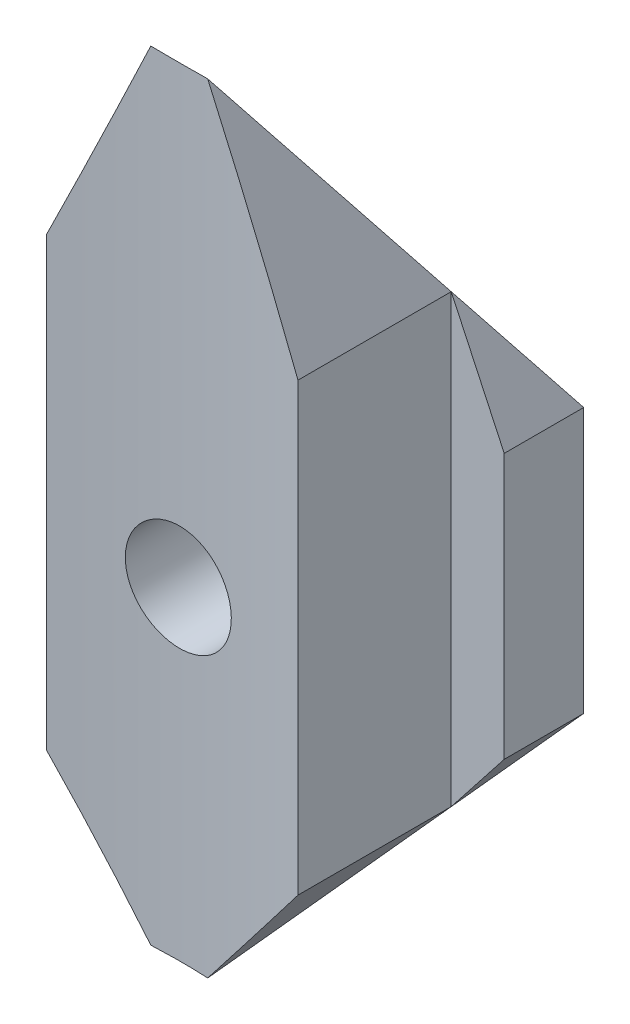
ISO-10303-21;
HEADER;
FILE_DESCRIPTION(('STEP AP214'),'2;1');
FILE_NAME('part.step','',(''),(''),'','','');
FILE_SCHEMA(('AUTOMOTIVE_DESIGN { 1 0 10303 214 1 1 1 1 }'));
ENDSEC;
DATA;
#1=APPLICATION_CONTEXT('core data for automotive mechanical design processes');
#2=APPLICATION_PROTOCOL_DEFINITION('international standard','automotive_design',2000,#1);
#3=PRODUCT_CONTEXT('',#1,'mechanical');
#4=PRODUCT('Part','Part','',(#3));
#5=PRODUCT_RELATED_PRODUCT_CATEGORY('part','',(#4));
#6=PRODUCT_DEFINITION_FORMATION('','',#4);
#7=PRODUCT_DEFINITION_CONTEXT('part definition',#1,'design');
#8=PRODUCT_DEFINITION('design','',#6,#7);
#9=PRODUCT_DEFINITION_SHAPE('','',#8);
#10=(LENGTH_UNIT() NAMED_UNIT(*) SI_UNIT(.MILLI.,.METRE.));
#11=(NAMED_UNIT(*) PLANE_ANGLE_UNIT() SI_UNIT($,.RADIAN.));
#12=(NAMED_UNIT(*) SI_UNIT($,.STERADIAN.) SOLID_ANGLE_UNIT());
#13=UNCERTAINTY_MEASURE_WITH_UNIT(LENGTH_MEASURE(1.E-05),#10,'distance_accuracy_value','');
#14=(GEOMETRIC_REPRESENTATION_CONTEXT(3) GLOBAL_UNCERTAINTY_ASSIGNED_CONTEXT((#13)) GLOBAL_UNIT_ASSIGNED_CONTEXT((#10,
#11,#12)) REPRESENTATION_CONTEXT('',''));
#15=CARTESIAN_POINT('',(0.,0.,0.));
#16=DIRECTION('',(0.,0.,1.));
#17=DIRECTION('',(1.,0.,0.));
#18=AXIS2_PLACEMENT_3D('',#15,#16,#17);
#19=CARTESIAN_POINT('',(6.75,30.,-8.5));
#20=DIRECTION('',(-1.,0.,0.));
#21=DIRECTION('',(0.,0.,1.));
#22=AXIS2_PLACEMENT_3D('',#19,#20,#21);
#23=PLANE('',#22);
#24=DIRECTION('',(0.,0.,-1.));
#25=VECTOR('',#24,1.);
#26=CARTESIAN_POINT('',(6.75000000000001,17.4565295089996,6.5));
#27=LINE('',#26,#25);
#28=CARTESIAN_POINT('',(6.75000000000001,17.4565295089996,-5.5));
#29=VERTEX_POINT('',#28);
#30=CARTESIAN_POINT('',(6.75000000000001,17.4565295089996,-8.5));
#31=VERTEX_POINT('',#30);
#32=EDGE_CURVE('E239',#29,#31,#27,.T.);
#33=ORIENTED_EDGE('',*,*,#32,.F.);
#34=DIRECTION('',(0.,-1.,0.));
#35=VECTOR('',#34,1.);
#36=CARTESIAN_POINT('',(6.75000000000001,30.,-5.5));
#37=LINE('',#36,#35);
#38=CARTESIAN_POINT('',(6.75000000000001,7.45652950899955,-5.5));
#39=VERTEX_POINT('',#38);
#40=EDGE_CURVE('E142',#29,#39,#37,.T.);
#41=ORIENTED_EDGE('',*,*,#40,.T.);
#42=DIRECTION('',(0.,0.,-1.));
#43=VECTOR('',#42,1.);
#44=CARTESIAN_POINT('',(6.75000000000001,7.45652950899955,6.5));
#45=LINE('',#44,#43);
#46=CARTESIAN_POINT('',(6.75000000000001,7.45652950899955,-8.5));
#47=VERTEX_POINT('',#46);
#48=EDGE_CURVE('E127',#39,#47,#45,.T.);
#49=ORIENTED_EDGE('',*,*,#48,.T.);
#50=DIRECTION('',(0.,-1.,0.));
#51=VECTOR('',#50,1.);
#52=CARTESIAN_POINT('',(6.75,30.,-8.5));
#53=LINE('',#52,#51);
#54=EDGE_CURVE('E140',#31,#47,#53,.T.);
#55=ORIENTED_EDGE('',*,*,#54,.F.);
#56=EDGE_LOOP('',(#33,#41,#49,#55));
#57=FACE_BOUND('',#56,.T.);
#58=ADVANCED_FACE('F41',(#57),#23,.F.);
#59=CARTESIAN_POINT('',(-6.74999999999999,30.,-5.5));
#60=DIRECTION('',(1.,0.,0.));
#61=DIRECTION('',(0.,0.,-1.));
#62=AXIS2_PLACEMENT_3D('',#59,#60,#61);
#63=PLANE('',#62);
#64=DIRECTION('',(0.,0.,-1.));
#65=VECTOR('',#64,1.);
#66=CARTESIAN_POINT('',(-6.75,17.4565295089996,6.5));
#67=LINE('',#66,#65);
#68=CARTESIAN_POINT('',(-6.75,17.4565295089996,-5.5));
#69=VERTEX_POINT('',#68);
#70=CARTESIAN_POINT('',(-6.75,17.4565295089996,-8.5));
#71=VERTEX_POINT('',#70);
#72=EDGE_CURVE('E236',#69,#71,#67,.T.);
#73=ORIENTED_EDGE('',*,*,#72,.T.);
#74=DIRECTION('',(0.,-1.,0.));
#75=VECTOR('',#74,1.);
#76=CARTESIAN_POINT('',(-6.75,30.,-8.5));
#77=LINE('',#76,#75);
#78=CARTESIAN_POINT('',(-6.75,7.45652950899955,-8.5));
#79=VERTEX_POINT('',#78);
#80=EDGE_CURVE('E161',#71,#79,#77,.T.);
#81=ORIENTED_EDGE('',*,*,#80,.T.);
#82=DIRECTION('',(0.,0.,-1.));
#83=VECTOR('',#82,1.);
#84=CARTESIAN_POINT('',(-6.75,7.45652950899955,6.5));
#85=LINE('',#84,#83);
#86=CARTESIAN_POINT('',(-6.75,7.45652950899955,-5.5));
#87=VERTEX_POINT('',#86);
#88=EDGE_CURVE('E144',#87,#79,#85,.T.);
#89=ORIENTED_EDGE('',*,*,#88,.F.);
#90=DIRECTION('',(0.,-1.,0.));
#91=VECTOR('',#90,1.);
#92=CARTESIAN_POINT('',(-6.74999999999999,30.,-5.5));
#93=LINE('',#92,#91);
#94=EDGE_CURVE('E165',#69,#87,#93,.T.);
#95=ORIENTED_EDGE('',*,*,#94,.F.);
#96=EDGE_LOOP('',(#73,#81,#89,#95));
#97=FACE_BOUND('',#96,.T.);
#98=ADVANCED_FACE('F235',(#97),#63,.F.);
#99=CARTESIAN_POINT('',(-4.74999999999999,30.,-5.5));
#100=DIRECTION('',(0.,0.,-1.));
#101=DIRECTION('',(-1.,0.,0.));
#102=AXIS2_PLACEMENT_3D('',#99,#100,#101);
#103=PLANE('',#102);
#104=DIRECTION('',(0.422988413872639,0.906135090220828,0.));
#105=VECTOR('',#104,1.);
#106=CARTESIAN_POINT('',(-1.58444197468115,28.5223016053543,-5.5));
#107=LINE('',#106,#105);
#108=CARTESIAN_POINT('',(-4.74999999999999,21.7409735292259,-5.5));
#109=VERTEX_POINT('',#108);
#110=EDGE_CURVE('E231',#69,#109,#107,.T.);
#111=ORIENTED_EDGE('',*,*,#110,.F.);
#112=ORIENTED_EDGE('',*,*,#94,.T.);
#113=DIRECTION('',(-0.617603270572078,0.786489796614471,0.));
#114=VECTOR('',#113,1.);
#115=CARTESIAN_POINT('',(-16.9373677887338,20.4296810481364,-5.49999999999999));
#116=LINE('',#115,#114);
#117=CARTESIAN_POINT('',(-4.75,4.90962007995474,-5.50000000000001));
#118=VERTEX_POINT('',#117);
#119=EDGE_CURVE('E211',#118,#87,#116,.T.);
#120=ORIENTED_EDGE('',*,*,#119,.F.);
#121=DIRECTION('',(0.,-1.,0.));
#122=VECTOR('',#121,1.);
#123=CARTESIAN_POINT('',(-4.74999999999999,30.,-5.5));
#124=LINE('',#123,#122);
#125=EDGE_CURVE('E222',#109,#118,#124,.T.);
#126=ORIENTED_EDGE('',*,*,#125,.F.);
#127=EDGE_LOOP('',(#111,#112,#120,#126));
#128=FACE_BOUND('',#127,.T.);
#129=ADVANCED_FACE('F229',(#128),#103,.F.);
#130=CARTESIAN_POINT('',(-4.74999999999999,30.,0.283032593109529));
#131=DIRECTION('',(1.,0.,0.));
#132=DIRECTION('',(0.,0.,-1.));
#133=AXIS2_PLACEMENT_3D('',#130,#131,#132);
#134=PLANE('',#133);
#135=DIRECTION('',(0.,0.,1.));
#136=VECTOR('',#135,1.);
#137=CARTESIAN_POINT('',(-4.74999999999999,21.7409735292259,0.283032593109529));
#138=LINE('',#137,#136);
#139=CARTESIAN_POINT('',(-4.74999999999999,21.7409735292259,0.283032593109529));
#140=VERTEX_POINT('',#139);
#141=EDGE_CURVE('E246',#109,#140,#138,.T.);
#142=ORIENTED_EDGE('',*,*,#141,.F.);
#143=ORIENTED_EDGE('',*,*,#125,.T.);
#144=DIRECTION('',(0.,0.,-1.));
#145=VECTOR('',#144,1.);
#146=CARTESIAN_POINT('',(-4.74999999999999,4.90962007995473,0.283032593109529));
#147=LINE('',#146,#145);
#148=CARTESIAN_POINT('',(-4.74999999999999,4.90962007995473,0.283032593109529));
#149=VERTEX_POINT('',#148);
#150=EDGE_CURVE('E209',#149,#118,#147,.T.);
#151=ORIENTED_EDGE('',*,*,#150,.F.);
#152=DIRECTION('',(0.,-1.,0.));
#153=VECTOR('',#152,1.);
#154=CARTESIAN_POINT('',(-4.74999999999999,30.,0.283032593109529));
#155=LINE('',#154,#153);
#156=EDGE_CURVE('E219',#140,#149,#155,.T.);
#157=ORIENTED_EDGE('',*,*,#156,.F.);
#158=EDGE_LOOP('',(#142,#143,#151,#157));
#159=FACE_BOUND('',#158,.T.);
#160=ADVANCED_FACE('F256',(#159),#134,.F.);
#161=CARTESIAN_POINT('',(0.,30.,40.));
#162=DIRECTION('',(0.,-1.,0.));
#163=DIRECTION('',(0.,0.,-1.));
#164=AXIS2_PLACEMENT_3D('',#161,#162,#163);
#165=CYLINDRICAL_SURFACE('',#164,40.);
#166=CARTESIAN_POINT('',(0.,14.4565295089996,0.));
#167=CARTESIAN_POINT('',(0.11226561691105,14.4565245543857,6.68941218069056E-07));
#168=CARTESIAN_POINT('',(0.224610849133381,14.4470450846484,0.000477695743243791));
#169=CARTESIAN_POINT('',(0.446202106970099,14.4093640353853,0.00233479079973984));
#170=CARTESIAN_POINT('',(0.555444322678374,14.3811403969083,0.00371592301722058));
#171=CARTESIAN_POINT('',(0.767587516754001,14.3067811034533,0.00722490791200662));
#172=CARTESIAN_POINT('',(0.870491695889499,14.2606545769807,0.00935237998494546));
#173=CARTESIAN_POINT('',(1.0670687455838,14.1518128960732,0.0141144397795993));
#174=CARTESIAN_POINT('',(1.16074378814924,14.0891016575846,0.0167489077506099));
#175=CARTESIAN_POINT('',(1.33632598574583,13.9488001649245,0.0222315728926882));
#176=CARTESIAN_POINT('',(1.41822266811324,13.8711968108571,0.0250799568829259));
#177=CARTESIAN_POINT('',(1.5678341577616,13.703340110993,0.0306678128961989));
#178=CARTESIAN_POINT('',(1.63554838571451,13.6130862486966,0.0334072804664903));
#179=CARTESIAN_POINT('',(1.7549016777892,13.42243557697,0.0384697065302309));
#180=CARTESIAN_POINT('',(1.80653256433003,13.3220336419973,0.0407924528879401));
#181=CARTESIAN_POINT('',(1.89220109729626,13.1139729458004,0.0447572310710058));
#182=CARTESIAN_POINT('',(1.92623887723076,13.0063142396527,0.0463992680620541));
#183=CARTESIAN_POINT('',(1.97572732304414,12.7868923687844,0.0488157703274723));
#184=CARTESIAN_POINT('',(1.99119365716441,12.6751327460641,0.0495909668943398));
#185=CARTESIAN_POINT('',(2.00314852073654,12.4506010608594,0.0501885666588715));
#186=CARTESIAN_POINT('',(1.99963719995225,12.3378290063718,0.0500109773755301));
#187=CARTESIAN_POINT('',(1.97374948002459,12.1145801432011,0.0487237116282245));
#188=CARTESIAN_POINT('',(1.95139001033192,12.0041013659042,0.0476148716191089));
#189=CARTESIAN_POINT('',(1.88846693076794,11.7884672809232,0.0445913990471616));
#190=CARTESIAN_POINT('',(1.84790324397277,11.6833119957361,0.0426767630793551));
#191=CARTESIAN_POINT('',(1.7497038510457,11.4812553315413,0.0382565307870804));
#192=CARTESIAN_POINT('',(1.69206042665315,11.3843577096815,0.035750667393977));
#193=CARTESIAN_POINT('',(1.56134346775138,11.201608035611,0.030430687980218));
#194=CARTESIAN_POINT('',(1.48826982434796,11.1157560613586,0.0276165697842128));
#195=CARTESIAN_POINT('',(1.32867118390876,10.9574361691118,0.0219935416725127));
#196=CARTESIAN_POINT('',(1.24213152637151,10.8849830288833,0.0191846408502466));
#197=CARTESIAN_POINT('',(1.05810892523512,10.7556313578359,0.013891610196134));
#198=CARTESIAN_POINT('',(0.960625978944205,10.698732830843,0.0114074804441733));
#199=CARTESIAN_POINT('',(0.757475340353888,10.6021069445533,0.00704384827841216));
#200=CARTESIAN_POINT('',(0.651807402377395,10.5623801009098,0.00516436402211598));
#201=CARTESIAN_POINT('',(0.43529014169846,10.5012349404002,0.00222210865747381));
#202=CARTESIAN_POINT('',(0.324440857791489,10.4798164864727,0.00115933143505013));
#203=CARTESIAN_POINT('',(0.100835801441982,10.4559143105024,-2.89471006151777E-05));
#204=CARTESIAN_POINT('',(-0.0119177809093448,10.4534101481857,-0.000155460211643967));
#205=CARTESIAN_POINT('',(-0.23624354753432,10.4673542971315,0.000540361418012085));
#206=CARTESIAN_POINT('',(-0.347815735713978,10.4838025457125,0.00136269302057018));
#207=CARTESIAN_POINT('',(-0.566554310425205,10.5351676928944,0.00386293130750737));
#208=CARTESIAN_POINT('',(-0.673722893926892,10.5700752585053,0.00554040561821324));
#209=CARTESIAN_POINT('',(-0.880679810996343,10.6573586794118,0.00956206844937632));
#210=CARTESIAN_POINT('',(-0.980468102077093,10.7097346352601,0.0119062608076329));
#211=CARTESIAN_POINT('',(-1.1699256637931,10.8305204066719,0.0170001698165979));
#212=CARTESIAN_POINT('',(-1.2595861896216,10.8989439240369,0.019750232261082));
#213=CARTESIAN_POINT('',(-1.42615516033645,11.0498625066938,0.0253450188142986));
#214=CARTESIAN_POINT('',(-1.50306352340609,11.132357662261,0.0281897435302349));
#215=CARTESIAN_POINT('',(-1.6420138362136,11.3091657173867,0.0336561094536801));
#216=CARTESIAN_POINT('',(-1.70404256088329,11.4034890173034,0.0362775508817325));
#217=CARTESIAN_POINT('',(-1.81138243847187,11.6012233147107,0.0409986023390366));
#218=CARTESIAN_POINT('',(-1.85669366414682,11.7046342726485,0.0430982146393224));
#219=CARTESIAN_POINT('',(-1.92928926590116,11.9175594323813,0.046537418497613));
#220=CARTESIAN_POINT('',(-1.95658207301353,12.0270707536947,0.0478773654705686));
#221=CARTESIAN_POINT('',(-1.9923936702811,12.2491283276836,0.0496471372129617));
#222=CARTESIAN_POINT('',(-2.00091256702396,12.3616745631248,0.0500769671495297));
#223=CARTESIAN_POINT('',(-1.99893350883703,12.5864755405263,0.0499779053949473));
#224=CARTESIAN_POINT('',(-1.98845635938041,12.6987304667078,0.0494500625971334));
#225=CARTESIAN_POINT('',(-1.94882562334041,12.9198854863023,0.0474973636395017));
#226=CARTESIAN_POINT('',(-1.91967200116262,13.028785573321,0.0460725057701147));
#227=CARTESIAN_POINT('',(-1.84352013202289,13.2401440021923,0.0424866051520056));
#228=CARTESIAN_POINT('',(-1.79652175410202,13.3426022967634,0.0403255570005496));
#229=CARTESIAN_POINT('',(-1.68601807913172,13.5381752757945,0.0355109107372312));
#230=CARTESIAN_POINT('',(-1.62251328855578,13.6312902468183,0.0328573277387455));
#231=CARTESIAN_POINT('',(-1.48072496730499,13.8056372980288,0.0273533786663928));
#232=CARTESIAN_POINT('',(-1.40242693454728,13.8868575777597,0.0245028212489989));
#233=CARTESIAN_POINT('',(-1.2332842397964,14.0350262282954,0.0189275512454243));
#234=CARTESIAN_POINT('',(-1.14243649593039,14.101971083135,0.0162028697910041));
#235=CARTESIAN_POINT('',(-0.950701902619181,14.2197198696222,0.0111844953742809));
#236=CARTESIAN_POINT('',(-0.849805517457556,14.2705082741377,0.00889121787164615));
#237=CARTESIAN_POINT('',(-0.640981745076911,14.3543634260826,0.00500027916869611));
#238=CARTESIAN_POINT('',(-0.533062832578584,14.3874511055095,0.00340179675973397));
#239=CARTESIAN_POINT('',(-0.353727852036426,14.4262866059985,0.00150335958820526));
#240=CARTESIAN_POINT('',(-0.283473365616929,14.4376132154822,0.000942077337848451));
#241=CARTESIAN_POINT('',(-0.142156561677924,14.4527362325698,0.000190185892287796));
#242=CARTESIAN_POINT('',(-0.0710942448477627,14.4565326465989,-4.23619199312314E-07));
#243=CARTESIAN_POINT('',(0.,14.4565295089996,0.));
#244=B_SPLINE_CURVE_WITH_KNOTS('',3,(#166,#167,#168,#169,#170,#171,#172,#173,#174,#175,#176,
#177,#178,#179,#180,#181,#182,#183,#184,#185,#186,#187,#188,#189,#190,#191,#192,#193,#194,#195,
#196,#197,#198,#199,#200,#201,#202,#203,#204,#205,#206,#207,#208,#209,#210,#211,#212,#213,#214,
#215,#216,#217,#218,#219,#220,#221,#222,#223,#224,#225,#226,#227,#228,#229,#230,#231,#232,#233,
#234,#235,#236,#237,#238,#239,#240,#241,#242,#243),.UNSPECIFIED.,.T.,.F.,(4,2,2,2,2,2,2,2,2,2,2,
2,2,2,2,2,2,2,2,2,2,2,2,2,2,2,2,2,2,2,2,2,2,2,2,2,2,2,4),(0.,0.336537330208493,
0.673471415625032,1.0102339269084,1.34691699344225,1.68389759324273,2.02089195541841,
2.35805738387917,2.69522025364953,3.03209846764322,3.36897402313642,3.70554731824559,
4.04212203559462,4.37884908219658,4.71557850522954,5.05267712546198,5.38977582861241,
5.7268846538922,6.06399095546453,6.40073290120862,6.73747373324478,7.07404447241389,
7.41061714900934,7.74747825258439,8.08434151734546,8.42150308697864,8.75866318923709,
9.09566541823679,9.43266573392305,9.76929717200414,10.1059292516535,10.4425638018228,
10.7791880241058,11.1161439737318,11.4531828183021,11.790544601777,12.1275065511194,
12.3406251214153,12.5537435098637),.UNSPECIFIED.);
#245=CARTESIAN_POINT('',(0.,14.4565295089996,0.));
#246=VERTEX_POINT('',#245);
#247=EDGE_CURVE('E44',#246,#246,#244,.T.);
#248=ORIENTED_EDGE('',*,*,#247,.T.);
#249=EDGE_LOOP('',(#248));
#250=FACE_BOUND('',#249,.T.);
#251=CARTESIAN_POINT('',(0.,31.9165280772635,40.));
#252=DIRECTION('',(0.906135090220828,0.422988413872639,0.));
#253=DIRECTION('',(0.422988413872639,-0.906135090220829,0.));
#254=AXIS2_PLACEMENT_3D('',#251,#252,#253);
#255=ELLIPSE('',#254,94.5652379311834,40.);
#256=CARTESIAN_POINT('',(1.07372423757106,29.6163723827468,0.0144136436433968));
#257=VERTEX_POINT('',#256);
#258=CARTESIAN_POINT('',(4.75000000000001,21.7409735292259,0.283032593109529));
#259=VERTEX_POINT('',#258);
#260=EDGE_CURVE('E201',#257,#259,#255,.F.);
#261=ORIENTED_EDGE('',*,*,#260,.F.);
#262=CARTESIAN_POINT('',(0.,86.7217078359924,40.));
#263=DIRECTION('',(0.,0.573576436351044,-0.819152044288993));
#264=DIRECTION('',(0.,-0.819152044288993,-0.573576436351044));
#265=AXIS2_PLACEMENT_3D('',#262,#263,#264);
#266=ELLIPSE('',#265,69.7378718248441,40.);
#267=CARTESIAN_POINT('',(-1.07372423757103,29.6163723827468,0.0144136436434289));
#268=VERTEX_POINT('',#267);
#269=EDGE_CURVE('E180',#268,#257,#266,.F.);
#270=ORIENTED_EDGE('',*,*,#269,.F.);
#271=CARTESIAN_POINT('',(0.,31.9165280772635,40.));
#272=DIRECTION('',(-0.906135090220828,0.422988413872639,0.));
#273=DIRECTION('',(-0.422988413872639,-0.906135090220829,0.));
#274=AXIS2_PLACEMENT_3D('',#271,#272,#273);
#275=ELLIPSE('',#274,94.5652379311834,40.);
#276=EDGE_CURVE('E69',#140,#268,#275,.F.);
#277=ORIENTED_EDGE('',*,*,#276,.F.);
#278=ORIENTED_EDGE('',*,*,#156,.T.);
#279=CARTESIAN_POINT('',(0.,-1.1392898140267,40.));
#280=DIRECTION('',(-0.786489796614471,-0.617603270572078,0.));
#281=DIRECTION('',(0.617603270572078,-0.786489796614471,0.));
#282=AXIS2_PLACEMENT_3D('',#279,#280,#281);
#283=ELLIPSE('',#282,64.7664963997819,40.);
#284=CARTESIAN_POINT('',(-1.07372423757105,0.228049378405135,0.0144136436433968));
#285=VERTEX_POINT('',#284);
#286=EDGE_CURVE('E207',#285,#149,#283,.F.);
#287=ORIENTED_EDGE('',*,*,#286,.F.);
#288=CARTESIAN_POINT('',(0.,-33.7185062605584,40.));
#289=DIRECTION('',(0.,-0.762326722926705,-0.647192372878289));
#290=DIRECTION('',(0.,-0.647192372878289,0.762326722926706));
#291=AXIS2_PLACEMENT_3D('',#288,#289,#290);
#292=ELLIPSE('',#291,52.470940342263,40.);
#293=CARTESIAN_POINT('',(1.07372423757108,0.228049378405149,0.0144136436433782));
#294=VERTEX_POINT('',#293);
#295=EDGE_CURVE('E213',#294,#285,#292,.F.);
#296=ORIENTED_EDGE('',*,*,#295,.F.);
#297=CARTESIAN_POINT('',(0.,-1.13928981402672,40.));
#298=DIRECTION('',(0.786489796614471,-0.617603270572078,0.));
#299=DIRECTION('',(-0.617603270572078,-0.786489796614471,0.));
#300=AXIS2_PLACEMENT_3D('',#297,#298,#299);
#301=ELLIPSE('',#300,64.7664963997819,40.);
#302=CARTESIAN_POINT('',(4.75000000000001,4.90962007995473,0.283032593109529));
#303=VERTEX_POINT('',#302);
#304=EDGE_CURVE('E61',#303,#294,#301,.F.);
#305=ORIENTED_EDGE('',*,*,#304,.F.);
#306=DIRECTION('',(0.,-1.,0.));
#307=VECTOR('',#306,1.);
#308=CARTESIAN_POINT('',(4.75000000000001,30.,0.283032593109529));
#309=LINE('',#308,#307);
#310=EDGE_CURVE('E194',#259,#303,#309,.T.);
#311=ORIENTED_EDGE('',*,*,#310,.F.);
#312=EDGE_LOOP('',(#261,#270,#277,#278,#287,#296,#305,#311));
#313=FACE_BOUND('',#312,.T.);
#314=ADVANCED_FACE('F250',(#250,#313),#165,.F.);
#315=CARTESIAN_POINT('',(4.75000000000001,30.,-5.5));
#316=DIRECTION('',(-1.,0.,0.));
#317=DIRECTION('',(0.,0.,1.));
#318=AXIS2_PLACEMENT_3D('',#315,#316,#317);
#319=PLANE('',#318);
#320=DIRECTION('',(0.,0.,-1.));
#321=VECTOR('',#320,1.);
#322=CARTESIAN_POINT('',(4.75000000000001,21.7409735292259,-5.50000000000001));
#323=LINE('',#322,#321);
#324=CARTESIAN_POINT('',(4.75,21.7409735292259,-5.5));
#325=VERTEX_POINT('',#324);
#326=EDGE_CURVE('E190',#259,#325,#323,.T.);
#327=ORIENTED_EDGE('',*,*,#326,.F.);
#328=ORIENTED_EDGE('',*,*,#310,.T.);
#329=DIRECTION('',(0.,0.,1.));
#330=VECTOR('',#329,1.);
#331=CARTESIAN_POINT('',(4.75000000000001,4.90962007995473,-5.49999999999999));
#332=LINE('',#331,#330);
#333=CARTESIAN_POINT('',(4.75000000000001,4.90962007995473,-5.5));
#334=VERTEX_POINT('',#333);
#335=EDGE_CURVE('E192',#334,#303,#332,.T.);
#336=ORIENTED_EDGE('',*,*,#335,.F.);
#337=DIRECTION('',(0.,-1.,0.));
#338=VECTOR('',#337,1.);
#339=CARTESIAN_POINT('',(4.75000000000001,30.,-5.5));
#340=LINE('',#339,#338);
#341=EDGE_CURVE('E186',#325,#334,#340,.T.);
#342=ORIENTED_EDGE('',*,*,#341,.F.);
#343=EDGE_LOOP('',(#327,#328,#336,#342));
#344=FACE_BOUND('',#343,.T.);
#345=ADVANCED_FACE('F188',(#344),#319,.F.);
#346=CARTESIAN_POINT('',(6.75000000000001,30.,-5.5));
#347=DIRECTION('',(0.,0.,-1.));
#348=DIRECTION('',(-1.,0.,0.));
#349=AXIS2_PLACEMENT_3D('',#346,#347,#348);
#350=PLANE('',#349);
#351=DIRECTION('',(0.422988413872639,-0.906135090220828,0.));
#352=VECTOR('',#351,1.);
#353=CARTESIAN_POINT('',(1.94228037122214,27.7557323162206,-5.5));
#354=LINE('',#353,#352);
#355=EDGE_CURVE('E196',#325,#29,#354,.T.);
#356=ORIENTED_EDGE('',*,*,#355,.F.);
#357=ORIENTED_EDGE('',*,*,#341,.T.);
#358=DIRECTION('',(-0.617603270572078,-0.786489796614471,0.));
#359=VECTOR('',#358,1.);
#360=CARTESIAN_POINT('',(17.7002353883765,21.4011583894577,-5.5));
#361=LINE('',#360,#359);
#362=EDGE_CURVE('E129',#39,#334,#361,.T.);
#363=ORIENTED_EDGE('',*,*,#362,.F.);
#364=ORIENTED_EDGE('',*,*,#40,.F.);
#365=EDGE_LOOP('',(#356,#357,#363,#364));
#366=FACE_BOUND('',#365,.T.);
#367=ADVANCED_FACE('F197',(#366),#350,.F.);
#368=CARTESIAN_POINT('',(-8.24999999999999,7.45652950899955,-8.5));
#369=DIRECTION('',(0.,-0.762326722926705,-0.647192372878289));
#370=DIRECTION('',(0.,0.647192372878289,-0.762326722926705));
#371=AXIS2_PLACEMENT_3D('',#368,#369,#370);
#372=PLANE('',#371);
#373=ORIENTED_EDGE('',*,*,#295,.T.);
#374=DIRECTION('',(-0.453064793101951,0.576957496759799,-0.679597189652925));
#375=VECTOR('',#374,1.);
#376=CARTESIAN_POINT('',(-7.05790156012276,7.8486282023467,-8.96185234018415));
#377=LINE('',#376,#375);
#378=EDGE_CURVE('E12',#285,#118,#377,.T.);
#379=ORIENTED_EDGE('',*,*,#378,.T.);
#380=EDGE_CURVE('E54',#118,#79,#377,.T.);
#381=ORIENTED_EDGE('',*,*,#380,.T.);
#382=DIRECTION('',(1.,0.,0.));
#383=VECTOR('',#382,1.);
#384=CARTESIAN_POINT('',(-8.24999999999999,7.45652950899955,-8.5));
#385=LINE('',#384,#383);
#386=EDGE_CURVE('E148',#79,#47,#385,.T.);
#387=ORIENTED_EDGE('',*,*,#386,.T.);
#388=DIRECTION('',(-0.453064793101951,-0.576957496759799,0.679597189652925));
#389=VECTOR('',#388,1.);
#390=CARTESIAN_POINT('',(3.67098439877231,3.53554257552809,-3.88147659815846));
#391=LINE('',#390,#389);
#392=EDGE_CURVE('E124',#47,#334,#391,.T.);
#393=ORIENTED_EDGE('',*,*,#392,.T.);
#394=EDGE_CURVE('E133',#334,#294,#391,.T.);
#395=ORIENTED_EDGE('',*,*,#394,.T.);
#396=EDGE_LOOP('',(#373,#379,#381,#387,#393,#395));
#397=FACE_BOUND('',#396,.T.);
#398=ADVANCED_FACE('F150',(#397),#372,.T.);
#399=CARTESIAN_POINT('',(-8.24999999999999,30.,0.283032593109525));
#400=DIRECTION('',(0.,0.573576436351044,-0.819152044288993));
#401=DIRECTION('',(0.,0.819152044288993,0.573576436351044));
#402=AXIS2_PLACEMENT_3D('',#399,#400,#401);
#403=PLANE('',#402);
#404=ORIENTED_EDGE('',*,*,#269,.T.);
#405=DIRECTION('',(0.357163013262932,-0.765122468210197,-0.535744519894397));
#406=VECTOR('',#405,1.);
#407=CARTESIAN_POINT('',(-0.271895516435005,32.4989886370217,2.0328432746525));
#408=LINE('',#407,#406);
#409=EDGE_CURVE('E171',#257,#325,#408,.T.);
#410=ORIENTED_EDGE('',*,*,#409,.T.);
#411=EDGE_CURVE('E169',#325,#31,#408,.T.);
#412=ORIENTED_EDGE('',*,*,#411,.T.);
#413=DIRECTION('',(1.,0.,0.));
#414=VECTOR('',#413,1.);
#415=CARTESIAN_POINT('',(-8.24999999999999,17.4565295089996,-8.5));
#416=LINE('',#415,#414);
#417=EDGE_CURVE('E155',#71,#31,#416,.T.);
#418=ORIENTED_EDGE('',*,*,#417,.F.);
#419=DIRECTION('',(0.357163013262932,0.765122468210198,0.535744519894397));
#420=VECTOR('',#419,1.);
#421=CARTESIAN_POINT('',(-1.83293388127543,27.9899767737131,-1.12440082191317));
#422=LINE('',#421,#420);
#423=EDGE_CURVE('E163',#71,#109,#422,.T.);
#424=ORIENTED_EDGE('',*,*,#423,.T.);
#425=EDGE_CURVE('E160',#109,#268,#422,.T.);
#426=ORIENTED_EDGE('',*,*,#425,.T.);
#427=EDGE_LOOP('',(#404,#410,#412,#418,#424,#426));
#428=FACE_BOUND('',#427,.T.);
#429=ADVANCED_FACE('F177',(#428),#403,.T.);
#430=CARTESIAN_POINT('',(-6.75,30.,-8.5));
#431=DIRECTION('',(0.,0.,1.));
#432=DIRECTION('',(1.,0.,0.));
#433=AXIS2_PLACEMENT_3D('',#430,#431,#432);
#434=PLANE('',#433);
#435=CARTESIAN_POINT('',(0.,12.4565295089996,-8.5));
#436=DIRECTION('',(0.,0.,-1.));
#437=DIRECTION('',(-1.,0.,0.));
#438=AXIS2_PLACEMENT_3D('',#435,#436,#437);
#439=CIRCLE('',#438,2.);
#440=CARTESIAN_POINT('',(-1.99999999999999,12.4565295089996,-8.5));
#441=VERTEX_POINT('',#440);
#442=EDGE_CURVE('E143',#441,#441,#439,.T.);
#443=ORIENTED_EDGE('',*,*,#442,.F.);
#444=EDGE_LOOP('',(#443));
#445=FACE_BOUND('',#444,.T.);
#446=ORIENTED_EDGE('',*,*,#417,.T.);
#447=ORIENTED_EDGE('',*,*,#54,.T.);
#448=ORIENTED_EDGE('',*,*,#386,.F.);
#449=ORIENTED_EDGE('',*,*,#80,.F.);
#450=EDGE_LOOP('',(#446,#447,#448,#449));
#451=FACE_BOUND('',#450,.T.);
#452=ADVANCED_FACE('F158',(#445,#451),#434,.F.);
#453=CARTESIAN_POINT('',(-0.894644937926965,30.,6.5));
#454=DIRECTION('',(-0.906135090220828,0.422988413872639,0.));
#455=DIRECTION('',(-0.422988413872639,-0.906135090220828,0.));
#456=AXIS2_PLACEMENT_3D('',#453,#454,#455);
#457=PLANE('',#456);
#458=ORIENTED_EDGE('',*,*,#141,.T.);
#459=ORIENTED_EDGE('',*,*,#276,.T.);
#460=ORIENTED_EDGE('',*,*,#425,.F.);
#461=EDGE_LOOP('',(#458,#459,#460));
#462=FACE_BOUND('',#461,.T.);
#463=ADVANCED_FACE('F258',(#462),#457,.T.);
#464=ORIENTED_EDGE('',*,*,#110,.T.);
#465=ORIENTED_EDGE('',*,*,#423,.F.);
#466=ORIENTED_EDGE('',*,*,#72,.F.);
#467=EDGE_LOOP('',(#464,#465,#466));
#468=FACE_BOUND('',#467,.T.);
#469=ADVANCED_FACE('F261',(#468),#457,.T.);
#470=CARTESIAN_POINT('',(6.75000000000001,17.4565295089996,6.5));
#471=DIRECTION('',(0.906135090220828,0.422988413872639,0.));
#472=DIRECTION('',(-0.422988413872639,0.906135090220828,0.));
#473=AXIS2_PLACEMENT_3D('',#470,#471,#472);
#474=PLANE('',#473);
#475=ORIENTED_EDGE('',*,*,#355,.T.);
#476=ORIENTED_EDGE('',*,*,#32,.T.);
#477=ORIENTED_EDGE('',*,*,#411,.F.);
#478=EDGE_LOOP('',(#475,#476,#477));
#479=FACE_BOUND('',#478,.T.);
#480=ADVANCED_FACE('F263',(#479),#474,.T.);
#481=ORIENTED_EDGE('',*,*,#326,.T.);
#482=ORIENTED_EDGE('',*,*,#409,.F.);
#483=ORIENTED_EDGE('',*,*,#260,.T.);
#484=EDGE_LOOP('',(#481,#482,#483));
#485=FACE_BOUND('',#484,.T.);
#486=ADVANCED_FACE('F248',(#485),#474,.T.);
#487=CARTESIAN_POINT('',(0.894644937926977,0.,6.5));
#488=DIRECTION('',(0.786489796614471,-0.617603270572078,0.));
#489=DIRECTION('',(0.617603270572078,0.786489796614471,0.));
#490=AXIS2_PLACEMENT_3D('',#487,#488,#489);
#491=PLANE('',#490);
#492=ORIENTED_EDGE('',*,*,#335,.T.);
#493=ORIENTED_EDGE('',*,*,#304,.T.);
#494=ORIENTED_EDGE('',*,*,#394,.F.);
#495=EDGE_LOOP('',(#492,#493,#494));
#496=FACE_BOUND('',#495,.T.);
#497=ADVANCED_FACE('F376',(#496),#491,.T.);
#498=ORIENTED_EDGE('',*,*,#362,.T.);
#499=ORIENTED_EDGE('',*,*,#392,.F.);
#500=ORIENTED_EDGE('',*,*,#48,.F.);
#501=EDGE_LOOP('',(#498,#499,#500));
#502=FACE_BOUND('',#501,.T.);
#503=ADVANCED_FACE('F126',(#502),#491,.T.);
#504=CARTESIAN_POINT('',(-6.75,7.45652950899955,6.5));
#505=DIRECTION('',(-0.786489796614471,-0.617603270572078,0.));
#506=DIRECTION('',(0.617603270572078,-0.786489796614471,0.));
#507=AXIS2_PLACEMENT_3D('',#504,#505,#506);
#508=PLANE('',#507);
#509=ORIENTED_EDGE('',*,*,#119,.T.);
#510=ORIENTED_EDGE('',*,*,#88,.T.);
#511=ORIENTED_EDGE('',*,*,#380,.F.);
#512=EDGE_LOOP('',(#509,#510,#511));
#513=FACE_BOUND('',#512,.T.);
#514=ADVANCED_FACE('F390',(#513),#508,.T.);
#515=ORIENTED_EDGE('',*,*,#150,.T.);
#516=ORIENTED_EDGE('',*,*,#378,.F.);
#517=ORIENTED_EDGE('',*,*,#286,.T.);
#518=EDGE_LOOP('',(#515,#516,#517));
#519=FACE_BOUND('',#518,.T.);
#520=ADVANCED_FACE('F292',(#519),#508,.T.);
#521=CARTESIAN_POINT('',(0.,12.4565295089996,6.5));
#522=DIRECTION('',(0.,0.,-1.));
#523=DIRECTION('',(-1.,0.,0.));
#524=AXIS2_PLACEMENT_3D('',#521,#522,#523);
#525=CYLINDRICAL_SURFACE('',#524,2.);
#526=ORIENTED_EDGE('',*,*,#442,.T.);
#527=EDGE_LOOP('',(#526));
#528=FACE_BOUND('',#527,.T.);
#529=ORIENTED_EDGE('',*,*,#247,.F.);
#530=EDGE_LOOP('',(#529));
#531=FACE_BOUND('',#530,.T.);
#532=ADVANCED_FACE('F289',(#528,#531),#525,.F.);
#533=CLOSED_SHELL('',(#58,#98,#129,#160,#314,#345,#367,#398,#429,#452,#463,#469,#480,#486,#497,
#503,#514,#520,#532));
#534=MANIFOLD_SOLID_BREP('B2',#533);
#535=ADVANCED_BREP_SHAPE_REPRESENTATION('',(#18,#534),#14);
#536=SHAPE_DEFINITION_REPRESENTATION(#9,#535);
ENDSEC;
END-ISO-10303-21;
